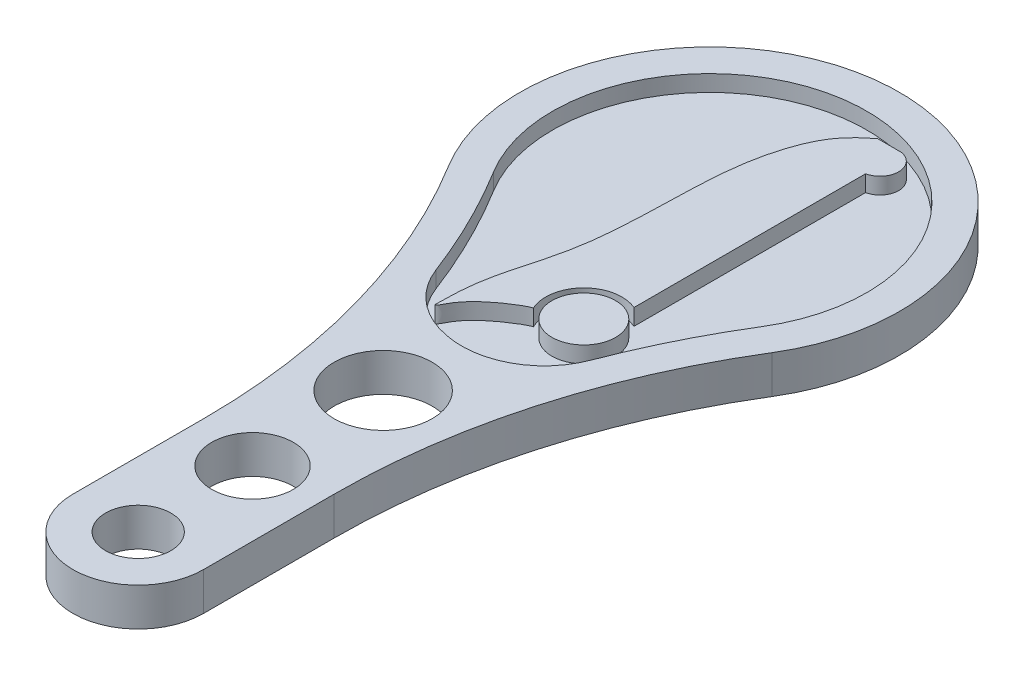
ISO-10303-21;
HEADER;
FILE_DESCRIPTION(('STEP AP214'),'2;1');
FILE_NAME('part.step','',(''),(''),'','','');
FILE_SCHEMA(('AUTOMOTIVE_DESIGN { 1 0 10303 214 1 1 1 1 }'));
ENDSEC;
DATA;
#1=APPLICATION_CONTEXT('core data for automotive mechanical design processes');
#2=APPLICATION_PROTOCOL_DEFINITION('international standard','automotive_design',2000,#1);
#3=PRODUCT_CONTEXT('',#1,'mechanical');
#4=PRODUCT('Part','Part','',(#3));
#5=PRODUCT_RELATED_PRODUCT_CATEGORY('part','',(#4));
#6=PRODUCT_DEFINITION_FORMATION('','',#4);
#7=PRODUCT_DEFINITION_CONTEXT('part definition',#1,'design');
#8=PRODUCT_DEFINITION('design','',#6,#7);
#9=PRODUCT_DEFINITION_SHAPE('','',#8);
#10=(LENGTH_UNIT() NAMED_UNIT(*) SI_UNIT(.MILLI.,.METRE.));
#11=(NAMED_UNIT(*) PLANE_ANGLE_UNIT() SI_UNIT($,.RADIAN.));
#12=(NAMED_UNIT(*) SI_UNIT($,.STERADIAN.) SOLID_ANGLE_UNIT());
#13=UNCERTAINTY_MEASURE_WITH_UNIT(LENGTH_MEASURE(1.E-05),#10,'distance_accuracy_value','');
#14=(GEOMETRIC_REPRESENTATION_CONTEXT(3) GLOBAL_UNCERTAINTY_ASSIGNED_CONTEXT((#13)) GLOBAL_UNIT_ASSIGNED_CONTEXT((#10,
#11,#12)) REPRESENTATION_CONTEXT('',''));
#15=CARTESIAN_POINT('',(0.,0.,0.));
#16=DIRECTION('',(0.,0.,1.));
#17=DIRECTION('',(1.,0.,0.));
#18=AXIS2_PLACEMENT_3D('',#15,#16,#17);
#19=CARTESIAN_POINT('',(2.35584712280132,1.33,10.0676855674392));
#20=DIRECTION('',(0.,1.,0.));
#21=DIRECTION('',(0.,0.,1.));
#22=AXIS2_PLACEMENT_3D('',#19,#20,#21);
#23=CYLINDRICAL_SURFACE('',#22,1.94920417460151);
#24=CARTESIAN_POINT('',(2.35584712280132,1.33,10.0676855674392));
#25=DIRECTION('',(0.,1.,0.));
#26=DIRECTION('',(0.,0.,1.));
#27=AXIS2_PLACEMENT_3D('',#24,#25,#26);
#28=CIRCLE('',#27,1.94920417460151);
#29=CARTESIAN_POINT('',(2.35584712280132,1.33,12.0168897420407));
#30=VERTEX_POINT('',#29);
#31=EDGE_CURVE('E11',#30,#30,#28,.T.);
#32=ORIENTED_EDGE('',*,*,#31,.T.);
#33=EDGE_LOOP('',(#32));
#34=FACE_BOUND('',#33,.T.);
#35=CARTESIAN_POINT('',(2.35584712280132,2.33,10.0676855674392));
#36=DIRECTION('',(0.,1.,0.));
#37=DIRECTION('',(0.,0.,1.));
#38=AXIS2_PLACEMENT_3D('',#35,#36,#37);
#39=CIRCLE('',#38,1.94920417460151);
#40=CARTESIAN_POINT('',(2.35584712280132,2.33,12.0168897420407));
#41=VERTEX_POINT('',#40);
#42=EDGE_CURVE('E49',#41,#41,#39,.T.);
#43=ORIENTED_EDGE('',*,*,#42,.F.);
#44=EDGE_LOOP('',(#43));
#45=FACE_BOUND('',#44,.T.);
#46=ADVANCED_FACE('F46',(#34,#45),#23,.T.);
#47=CARTESIAN_POINT('',(2.35584712280132,1.33,10.0676855674392));
#48=DIRECTION('',(0.,1.,0.));
#49=DIRECTION('',(0.,0.,1.));
#50=AXIS2_PLACEMENT_3D('',#47,#48,#49);
#51=PLANE('',#50);
#52=ORIENTED_EDGE('',*,*,#31,.F.);
#53=EDGE_LOOP('',(#52));
#54=FACE_BOUND('',#53,.T.);
#55=ADVANCED_FACE('F61',(#54),#51,.F.);
#56=CARTESIAN_POINT('',(2.35584712280132,2.33,10.0676855674392));
#57=DIRECTION('',(0.,1.,0.));
#58=DIRECTION('',(0.,0.,1.));
#59=AXIS2_PLACEMENT_3D('',#56,#57,#58);
#60=PLANE('',#59);
#61=ORIENTED_EDGE('',*,*,#42,.T.);
#62=EDGE_LOOP('',(#61));
#63=FACE_BOUND('',#62,.T.);
#64=ADVANCED_FACE('F58',(#63),#60,.T.);
#65=CLOSED_SHELL('',(#46,#55,#64));
#66=MANIFOLD_SOLID_BREP('B2',#65);
#67=CARTESIAN_POINT('',(1.78111711567941,1.33,-8.49492551439647));
#68=CARTESIAN_POINT('',(1.18318005927332,1.33,-8.00468919719487));
#69=CARTESIAN_POINT('',(0.982734781173089,1.33,-7.85157907838593));
#70=CARTESIAN_POINT('',(0.615420042679695,1.33,-7.44626626349667));
#71=CARTESIAN_POINT('',(0.330434469710681,1.33,-7.1106165886665));
#72=CARTESIAN_POINT('',(0.146777100463983,1.33,-6.85729607936071));
#73=CARTESIAN_POINT('',(-0.0835103105367978,1.33,-6.45480446057078));
#74=CARTESIAN_POINT('',(-0.339895147826504,1.33,-5.9612636487881));
#75=CARTESIAN_POINT('',(-0.668740254169848,1.33,-5.13014954373743));
#76=CARTESIAN_POINT('',(-0.942295018251991,1.33,-4.23132674746753));
#77=CARTESIAN_POINT('',(-1.14785582363387,1.33,-3.08008028249636));
#78=CARTESIAN_POINT('',(-1.28640882004444,1.33,-2.29248229105088));
#79=CARTESIAN_POINT('',(-1.28640882004444,1.33,-1.55115416078759));
#80=CARTESIAN_POINT('',(-1.37392048526993,1.33,-0.287096774197148));
#81=CARTESIAN_POINT('',(-1.45378432660316,1.33,1.92929888613166));
#82=CARTESIAN_POINT('',(-0.777696731086684,1.33,4.1071464967863));
#83=CARTESIAN_POINT('',(-1.58677607690457,1.33,5.4842603874083));
#84=CARTESIAN_POINT('',(-1.3142933284438,1.33,6.862486952761));
#85=CARTESIAN_POINT('',(-1.56478861208296,1.33,7.97301604356127));
#86=CARTESIAN_POINT('',(-3.15960858458561,1.33,9.67638397230756));
#87=CARTESIAN_POINT('',(-2.89320982157634,1.33,11.6792849185938));
#88=CARTESIAN_POINT('',(-2.9648414120418,1.33,13.8615451008543));
#89=B_SPLINE_CURVE_WITH_KNOTS('',21,(#67,#68,#69,#70,#71,#72,#73,#74,#75,#76,#77,#78,#79,#80,
#81,#82,#83,#84,#85,#86,#87,#88),.UNSPECIFIED.,.F.,.F.,(22,22),(0.,1.),.UNSPECIFIED.);
#90=DIRECTION('',(0.,1.,0.));
#91=VECTOR('',#90,1.);
#92=SURFACE_OF_LINEAR_EXTRUSION('',#89,#91);
#93=CARTESIAN_POINT('',(1.78111711567941,2.33,-8.49492551439647));
#94=CARTESIAN_POINT('',(1.18318005927332,2.33,-8.00468919719487));
#95=CARTESIAN_POINT('',(0.982734781173089,2.33,-7.85157907838593));
#96=CARTESIAN_POINT('',(0.615420042679695,2.33,-7.44626626349667));
#97=CARTESIAN_POINT('',(0.330434469710681,2.33,-7.1106165886665));
#98=CARTESIAN_POINT('',(0.146777100463983,2.33,-6.85729607936071));
#99=CARTESIAN_POINT('',(-0.0835103105367978,2.33,-6.45480446057078));
#100=CARTESIAN_POINT('',(-0.339895147826504,2.33,-5.9612636487881));
#101=CARTESIAN_POINT('',(-0.668740254169848,2.33,-5.13014954373743));
#102=CARTESIAN_POINT('',(-0.942295018251991,2.33,-4.23132674746753));
#103=CARTESIAN_POINT('',(-1.14785582363387,2.33,-3.08008028249636));
#104=CARTESIAN_POINT('',(-1.28640882004444,2.33,-2.29248229105088));
#105=CARTESIAN_POINT('',(-1.28640882004444,2.33,-1.55115416078759));
#106=CARTESIAN_POINT('',(-1.37392048526993,2.33,-0.287096774197148));
#107=CARTESIAN_POINT('',(-1.45378432660316,2.33,1.92929888613166));
#108=CARTESIAN_POINT('',(-0.777696731086684,2.33,4.1071464967863));
#109=CARTESIAN_POINT('',(-1.58677607690457,2.33,5.4842603874083));
#110=CARTESIAN_POINT('',(-1.3142933284438,2.33,6.862486952761));
#111=CARTESIAN_POINT('',(-1.56478861208296,2.33,7.97301604356127));
#112=CARTESIAN_POINT('',(-3.15960858458561,2.33,9.67638397230756));
#113=CARTESIAN_POINT('',(-2.89320982157634,2.33,11.6792849185938));
#114=CARTESIAN_POINT('',(-2.9648414120418,2.33,13.8615451008543));
#115=B_SPLINE_CURVE_WITH_KNOTS('',21,(#93,#94,#95,#96,#97,#98,#99,#100,#101,#102,#103,#104,#105,
#106,#107,#108,#109,#110,#111,#112,#113,#114),.UNSPECIFIED.,.F.,.F.,(22,22),(0.,1.),.UNSPECIFIED.);
#116=CARTESIAN_POINT('',(1.78111711567941,2.33,-8.49492551439647));
#117=VERTEX_POINT('',#116);
#118=CARTESIAN_POINT('',(-2.9648414120418,2.33,13.8615451008543));
#119=VERTEX_POINT('',#118);
#120=EDGE_CURVE('E188',#117,#119,#115,.T.);
#121=ORIENTED_EDGE('',*,*,#120,.F.);
#122=DIRECTION('',(0.,1.,0.));
#123=VECTOR('',#122,1.);
#124=CARTESIAN_POINT('',(1.78111711567941,1.33,-8.49492551439647));
#125=LINE('',#124,#123);
#126=CARTESIAN_POINT('',(1.78111711567941,1.33,-8.49492551439647));
#127=VERTEX_POINT('',#126);
#128=EDGE_CURVE('E44',#127,#117,#125,.T.);
#129=ORIENTED_EDGE('',*,*,#128,.F.);
#130=CARTESIAN_POINT('',(-2.9648414120418,1.33,13.8615451008543));
#131=VERTEX_POINT('',#130);
#132=EDGE_CURVE('E215',#127,#131,#89,.T.);
#133=ORIENTED_EDGE('',*,*,#132,.T.);
#134=DIRECTION('',(0.,1.,0.));
#135=VECTOR('',#134,1.);
#136=CARTESIAN_POINT('',(-2.9648414120418,1.33,13.8615451008543));
#137=LINE('',#136,#135);
#138=EDGE_CURVE('E100',#131,#119,#137,.T.);
#139=ORIENTED_EDGE('',*,*,#138,.T.);
#140=EDGE_LOOP('',(#121,#129,#133,#139));
#141=FACE_BOUND('',#140,.T.);
#142=ADVANCED_FACE('F96',(#141),#92,.T.);
#143=CARTESIAN_POINT('',(1.78111711567941,1.33,-8.49492551439647));
#144=DIRECTION('',(0.,0.,-1.));
#145=DIRECTION('',(-1.,0.,0.));
#146=AXIS2_PLACEMENT_3D('',#143,#144,#145);
#147=PLANE('',#146);
#148=DIRECTION('',(-1.,0.,0.));
#149=VECTOR('',#148,1.);
#150=CARTESIAN_POINT('',(1.78111711567941,2.33,-8.49492551439647));
#151=LINE('',#150,#149);
#152=CARTESIAN_POINT('',(3.28111711567941,2.33,-8.49492551439647));
#153=VERTEX_POINT('',#152);
#154=EDGE_CURVE('E213',#153,#117,#151,.T.);
#155=ORIENTED_EDGE('',*,*,#154,.F.);
#156=DIRECTION('',(0.,1.,0.));
#157=VECTOR('',#156,1.);
#158=CARTESIAN_POINT('',(3.28111711567941,1.33,-8.49492551439647));
#159=LINE('',#158,#157);
#160=CARTESIAN_POINT('',(3.28111711567941,1.33,-8.49492551439647));
#161=VERTEX_POINT('',#160);
#162=EDGE_CURVE('E106',#161,#153,#159,.T.);
#163=ORIENTED_EDGE('',*,*,#162,.F.);
#164=DIRECTION('',(-1.,0.,0.));
#165=VECTOR('',#164,1.);
#166=CARTESIAN_POINT('',(1.78111711567941,1.33,-8.49492551439647));
#167=LINE('',#166,#165);
#168=EDGE_CURVE('E178',#161,#127,#167,.T.);
#169=ORIENTED_EDGE('',*,*,#168,.T.);
#170=ORIENTED_EDGE('',*,*,#128,.T.);
#171=EDGE_LOOP('',(#155,#163,#169,#170));
#172=FACE_BOUND('',#171,.T.);
#173=ADVANCED_FACE('F225',(#172),#147,.T.);
#174=CARTESIAN_POINT('',(3.28111711567941,1.33,-8.49492551439647));
#175=DIRECTION('',(1.,0.,0.));
#176=DIRECTION('',(0.,0.,-1.));
#177=AXIS2_PLACEMENT_3D('',#174,#175,#176);
#178=PLANE('',#177);
#179=DIRECTION('',(0.,0.,-1.));
#180=VECTOR('',#179,1.);
#181=CARTESIAN_POINT('',(3.28111711567941,2.33,-8.49492551439647));
#182=LINE('',#181,#180);
#183=CARTESIAN_POINT('',(3.28111711567941,2.33,-8.49086116477634));
#184=VERTEX_POINT('',#183);
#185=EDGE_CURVE('E165',#184,#153,#182,.T.);
#186=ORIENTED_EDGE('',*,*,#185,.F.);
#187=DIRECTION('',(0.,1.,0.));
#188=VECTOR('',#187,1.);
#189=CARTESIAN_POINT('',(3.28111711567941,1.33,-8.49086116477634));
#190=LINE('',#189,#188);
#191=CARTESIAN_POINT('',(3.28111711567941,1.33,-8.49086116477634));
#192=VERTEX_POINT('',#191);
#193=EDGE_CURVE('E160',#192,#184,#190,.T.);
#194=ORIENTED_EDGE('',*,*,#193,.F.);
#195=DIRECTION('',(0.,0.,-1.));
#196=VECTOR('',#195,1.);
#197=CARTESIAN_POINT('',(3.28111711567941,1.33,-8.49492551439647));
#198=LINE('',#197,#196);
#199=EDGE_CURVE('E163',#192,#161,#198,.T.);
#200=ORIENTED_EDGE('',*,*,#199,.T.);
#201=ORIENTED_EDGE('',*,*,#162,.T.);
#202=EDGE_LOOP('',(#186,#194,#200,#201));
#203=FACE_BOUND('',#202,.T.);
#204=ADVANCED_FACE('F162',(#203),#178,.T.);
#205=CARTESIAN_POINT('',(3.05515238745392,1.33,-7.37826065267223));
#206=DIRECTION('',(0.,1.,0.));
#207=DIRECTION('',(0.,0.,1.));
#208=AXIS2_PLACEMENT_3D('',#205,#206,#207);
#209=CYLINDRICAL_SURFACE('',#208,1.13531491575524);
#210=CARTESIAN_POINT('',(3.05515238745392,2.33,-7.37826065267223));
#211=DIRECTION('',(0.,1.,0.));
#212=DIRECTION('',(0.,0.,1.));
#213=AXIS2_PLACEMENT_3D('',#210,#211,#212);
#214=CIRCLE('',#213,1.13531491575524);
#215=CARTESIAN_POINT('',(3.28111711567941,2.33,-6.26566014056813));
#216=VERTEX_POINT('',#215);
#217=EDGE_CURVE('E210',#216,#184,#214,.T.);
#218=ORIENTED_EDGE('',*,*,#217,.F.);
#219=DIRECTION('',(0.,1.,0.));
#220=VECTOR('',#219,1.);
#221=CARTESIAN_POINT('',(3.28111711567941,1.33,-6.26566014056813));
#222=LINE('',#221,#220);
#223=CARTESIAN_POINT('',(3.28111711567941,1.33,-6.26566014056813));
#224=VERTEX_POINT('',#223);
#225=EDGE_CURVE('E170',#224,#216,#222,.T.);
#226=ORIENTED_EDGE('',*,*,#225,.F.);
#227=CARTESIAN_POINT('',(3.05515238745392,1.33,-7.37826065267223));
#228=DIRECTION('',(0.,1.,0.));
#229=DIRECTION('',(0.,0.,1.));
#230=AXIS2_PLACEMENT_3D('',#227,#228,#229);
#231=CIRCLE('',#230,1.13531491575524);
#232=EDGE_CURVE('E176',#224,#192,#231,.T.);
#233=ORIENTED_EDGE('',*,*,#232,.T.);
#234=ORIENTED_EDGE('',*,*,#193,.T.);
#235=EDGE_LOOP('',(#218,#226,#233,#234));
#236=FACE_BOUND('',#235,.T.);
#237=ADVANCED_FACE('F180',(#236),#209,.T.);
#238=CARTESIAN_POINT('',(3.28111711567941,1.33,-6.26566014056813));
#239=DIRECTION('',(1.,0.,0.));
#240=DIRECTION('',(0.,0.,-1.));
#241=AXIS2_PLACEMENT_3D('',#238,#239,#240);
#242=PLANE('',#241);
#243=DIRECTION('',(0.,0.,-1.));
#244=VECTOR('',#243,1.);
#245=CARTESIAN_POINT('',(3.28111711567941,2.33,-6.26566014056813));
#246=LINE('',#245,#244);
#247=CARTESIAN_POINT('',(3.28111711567941,2.33,7.92174945219014));
#248=VERTEX_POINT('',#247);
#249=EDGE_CURVE('E207',#248,#216,#246,.T.);
#250=ORIENTED_EDGE('',*,*,#249,.F.);
#251=DIRECTION('',(0.,1.,0.));
#252=VECTOR('',#251,1.);
#253=CARTESIAN_POINT('',(3.28111711567941,1.33,7.92174945219014));
#254=LINE('',#253,#252);
#255=CARTESIAN_POINT('',(3.28111711567941,1.33,7.92174945219014));
#256=VERTEX_POINT('',#255);
#257=EDGE_CURVE('E219',#256,#248,#254,.T.);
#258=ORIENTED_EDGE('',*,*,#257,.F.);
#259=DIRECTION('',(0.,0.,-1.));
#260=VECTOR('',#259,1.);
#261=CARTESIAN_POINT('',(3.28111711567941,1.33,-6.26566014056813));
#262=LINE('',#261,#260);
#263=EDGE_CURVE('E181',#256,#224,#262,.T.);
#264=ORIENTED_EDGE('',*,*,#263,.T.);
#265=ORIENTED_EDGE('',*,*,#225,.T.);
#266=EDGE_LOOP('',(#250,#258,#264,#265));
#267=FACE_BOUND('',#266,.T.);
#268=ADVANCED_FACE('F238',(#267),#242,.T.);
#269=CARTESIAN_POINT('',(2.35584712280132,1.33,10.0676855674392));
#270=DIRECTION('',(0.,1.,0.));
#271=DIRECTION('',(0.,0.,1.));
#272=AXIS2_PLACEMENT_3D('',#269,#270,#271);
#273=CYLINDRICAL_SURFACE('',#272,2.33691385601845);
#274=CARTESIAN_POINT('',(2.35584712280132,2.33,10.0676855674392));
#275=DIRECTION('',(0.,-1.,0.));
#276=DIRECTION('',(0.,0.,1.));
#277=AXIS2_PLACEMENT_3D('',#274,#275,#276);
#278=CIRCLE('',#277,2.33691385601845);
#279=CARTESIAN_POINT('',(0.226117198706706,2.33,11.029671440967));
#280=VERTEX_POINT('',#279);
#281=EDGE_CURVE('E201',#280,#248,#278,.T.);
#282=ORIENTED_EDGE('',*,*,#281,.F.);
#283=DIRECTION('',(0.,1.,0.));
#284=VECTOR('',#283,1.);
#285=CARTESIAN_POINT('',(0.226117198706706,1.33,11.029671440967));
#286=LINE('',#285,#284);
#287=CARTESIAN_POINT('',(0.226117198706706,1.33,11.029671440967));
#288=VERTEX_POINT('',#287);
#289=EDGE_CURVE('E220',#288,#280,#286,.T.);
#290=ORIENTED_EDGE('',*,*,#289,.F.);
#291=CARTESIAN_POINT('',(2.35584712280132,1.33,10.0676855674392));
#292=DIRECTION('',(0.,-1.,0.));
#293=DIRECTION('',(0.,0.,1.));
#294=AXIS2_PLACEMENT_3D('',#291,#292,#293);
#295=CIRCLE('',#294,2.33691385601845);
#296=EDGE_CURVE('E183',#288,#256,#295,.T.);
#297=ORIENTED_EDGE('',*,*,#296,.T.);
#298=ORIENTED_EDGE('',*,*,#257,.T.);
#299=EDGE_LOOP('',(#282,#290,#297,#298));
#300=FACE_BOUND('',#299,.T.);
#301=ADVANCED_FACE('F241',(#300),#273,.F.);
#302=CARTESIAN_POINT('',(-2.9648414120418,1.33,13.8615451008543));
#303=CARTESIAN_POINT('',(-2.68941343013303,1.33,13.8577408821963));
#304=CARTESIAN_POINT('',(-2.76468354600282,1.33,13.1389949437615));
#305=CARTESIAN_POINT('',(-2.08602989904163,1.33,12.4170286257182));
#306=CARTESIAN_POINT('',(-1.11541292891549,1.33,11.7514256517854));
#307=CARTESIAN_POINT('',(-0.160442749527065,1.33,11.1270053622062));
#308=CARTESIAN_POINT('',(0.226117198706707,1.33,11.029671440967));
#309=B_SPLINE_CURVE_WITH_KNOTS('',6,(#302,#303,#304,#305,#306,#307,#308),.UNSPECIFIED.,.F.,.F.,
(7,7),(0.,1.),.UNSPECIFIED.);
#310=DIRECTION('',(0.,1.,0.));
#311=VECTOR('',#310,1.);
#312=SURFACE_OF_LINEAR_EXTRUSION('',#309,#311);
#313=CARTESIAN_POINT('',(-2.9648414120418,2.33,13.8615451008543));
#314=CARTESIAN_POINT('',(-2.68941343013303,2.33,13.8577408821963));
#315=CARTESIAN_POINT('',(-2.76468354600282,2.33,13.1389949437615));
#316=CARTESIAN_POINT('',(-2.08602989904163,2.33,12.4170286257182));
#317=CARTESIAN_POINT('',(-1.11541292891549,2.33,11.7514256517854));
#318=CARTESIAN_POINT('',(-0.160442749527065,2.33,11.1270053622062));
#319=CARTESIAN_POINT('',(0.226117198706707,2.33,11.029671440967));
#320=B_SPLINE_CURVE_WITH_KNOTS('',6,(#313,#314,#315,#316,#317,#318,#319),.UNSPECIFIED.,.F.,.F.,
(7,7),(0.,1.),.UNSPECIFIED.);
#321=EDGE_CURVE('E193',#119,#280,#320,.T.);
#322=ORIENTED_EDGE('',*,*,#321,.F.);
#323=ORIENTED_EDGE('',*,*,#138,.F.);
#324=EDGE_CURVE('E247',#131,#288,#309,.T.);
#325=ORIENTED_EDGE('',*,*,#324,.T.);
#326=ORIENTED_EDGE('',*,*,#289,.T.);
#327=EDGE_LOOP('',(#322,#323,#325,#326));
#328=FACE_BOUND('',#327,.T.);
#329=ADVANCED_FACE('F222',(#328),#312,.T.);
#330=CARTESIAN_POINT('',(-1.05934022035526,1.33,-2.53747828552304));
#331=DIRECTION('',(0.,-1.,0.));
#332=DIRECTION('',(0.,0.,-1.));
#333=AXIS2_PLACEMENT_3D('',#330,#331,#332);
#334=PLANE('',#333);
#335=ORIENTED_EDGE('',*,*,#132,.F.);
#336=ORIENTED_EDGE('',*,*,#168,.F.);
#337=ORIENTED_EDGE('',*,*,#199,.F.);
#338=ORIENTED_EDGE('',*,*,#232,.F.);
#339=ORIENTED_EDGE('',*,*,#263,.F.);
#340=ORIENTED_EDGE('',*,*,#296,.F.);
#341=ORIENTED_EDGE('',*,*,#324,.F.);
#342=EDGE_LOOP('',(#335,#336,#337,#338,#339,#340,#341));
#343=FACE_BOUND('',#342,.T.);
#344=ADVANCED_FACE('F174',(#343),#334,.T.);
#345=CARTESIAN_POINT('',(-1.05934022035526,2.33,-2.53747828552304));
#346=DIRECTION('',(0.,-1.,0.));
#347=DIRECTION('',(0.,0.,-1.));
#348=AXIS2_PLACEMENT_3D('',#345,#346,#347);
#349=PLANE('',#348);
#350=ORIENTED_EDGE('',*,*,#120,.T.);
#351=ORIENTED_EDGE('',*,*,#321,.T.);
#352=ORIENTED_EDGE('',*,*,#281,.T.);
#353=ORIENTED_EDGE('',*,*,#249,.T.);
#354=ORIENTED_EDGE('',*,*,#217,.T.);
#355=ORIENTED_EDGE('',*,*,#185,.T.);
#356=ORIENTED_EDGE('',*,*,#154,.T.);
#357=EDGE_LOOP('',(#350,#351,#352,#353,#354,#355,#356));
#358=FACE_BOUND('',#357,.T.);
#359=ADVANCED_FACE('F224',(#358),#349,.F.);
#360=CLOSED_SHELL('',(#142,#173,#204,#237,#268,#301,#329,#344,#359));
#361=MANIFOLD_SOLID_BREP('B6',#360);
#362=CARTESIAN_POINT('',(0.,2.33,0.));
#363=DIRECTION('',(0.,1.,0.));
#364=DIRECTION('',(0.,0.,1.));
#365=AXIS2_PLACEMENT_3D('',#362,#363,#364);
#366=PLANE('',#365);
#367=CARTESIAN_POINT('',(0.,2.33,35.));
#368=DIRECTION('',(0.,1.,0.));
#369=DIRECTION('',(0.,0.,1.));
#370=AXIS2_PLACEMENT_3D('',#367,#368,#369);
#371=CIRCLE('',#370,2.);
#372=CARTESIAN_POINT('',(0.,2.33,37.));
#373=VERTEX_POINT('',#372);
#374=EDGE_CURVE('E551',#373,#373,#371,.T.);
#375=ORIENTED_EDGE('',*,*,#374,.F.);
#376=EDGE_LOOP('',(#375));
#377=FACE_BOUND('',#376,.T.);
#378=DIRECTION('',(-3.08600307322036E-05,0.,-0.999999999523829));
#379=VECTOR('',#378,1.);
#380=CARTESIAN_POINT('',(3.99925674937041,2.33,10.9154280929616));
#381=LINE('',#380,#379);
#382=CARTESIAN_POINT('',(3.99999999999999,2.33,35.));
#383=VERTEX_POINT('',#382);
#384=CARTESIAN_POINT('',(3.99975325061723,2.33,27.0042405405633));
#385=VERTEX_POINT('',#384);
#386=EDGE_CURVE('E565',#383,#385,#381,.T.);
#387=ORIENTED_EDGE('',*,*,#386,.T.);
#388=CARTESIAN_POINT('',(43.9997532315704,2.33,27.003006139334));
#389=DIRECTION('',(0.,1.,0.));
#390=DIRECTION('',(0.,0.,1.));
#391=AXIS2_PLACEMENT_3D('',#388,#389,#390);
#392=CIRCLE('',#391,40.);
#393=CARTESIAN_POINT('',(9.90793474706065,2.33,6.08058007495899));
#394=VERTEX_POINT('',#393);
#395=EDGE_CURVE('E594',#385,#394,#392,.F.);
#396=ORIENTED_EDGE('',*,*,#395,.T.);
#397=CARTESIAN_POINT('',(0.,2.33,0.));
#398=DIRECTION('',(0.,1.,0.));
#399=DIRECTION('',(0.,0.,1.));
#400=AXIS2_PLACEMENT_3D('',#397,#398,#399);
#401=CIRCLE('',#400,11.625);
#402=CARTESIAN_POINT('',(-9.9075208807045,2.33,6.08125439349516));
#403=VERTEX_POINT('',#402);
#404=EDGE_CURVE('E557',#394,#403,#401,.T.);
#405=ORIENTED_EDGE('',*,*,#404,.T.);
#406=CARTESIAN_POINT('',(-43.9979153089351,2.33,27.0060006936936));
#407=DIRECTION('',(0.,1.,0.));
#408=DIRECTION('',(0.,0.,1.));
#409=AXIS2_PLACEMENT_3D('',#406,#407,#408);
#410=CIRCLE('',#409,40.);
#411=CARTESIAN_POINT('',(-3.99791667085768,2.33,27.0164387877521));
#412=VERTEX_POINT('',#411);
#413=EDGE_CURVE('E598',#403,#412,#410,.F.);
#414=ORIENTED_EDGE('',*,*,#413,.T.);
#415=DIRECTION('',(-0.000260952351462385,0.,0.999999965951935));
#416=VECTOR('',#415,1.);
#417=CARTESIAN_POINT('',(-3.99371560348128,2.33,10.917456694602));
#418=LINE('',#417,#416);
#419=CARTESIAN_POINT('',(-3.99999999999998,2.33,35.));
#420=VERTEX_POINT('',#419);
#421=EDGE_CURVE('E560',#412,#420,#418,.T.);
#422=ORIENTED_EDGE('',*,*,#421,.T.);
#423=CARTESIAN_POINT('',(0.,2.33,35.));
#424=DIRECTION('',(0.,1.,0.));
#425=DIRECTION('',(0.,0.,1.));
#426=AXIS2_PLACEMENT_3D('',#423,#424,#425);
#427=CIRCLE('',#426,3.99999999999999);
#428=EDGE_CURVE('E563',#420,#383,#427,.T.);
#429=ORIENTED_EDGE('',*,*,#428,.T.);
#430=EDGE_LOOP('',(#387,#396,#405,#414,#422,#429));
#431=FACE_BOUND('',#430,.T.);
#432=CARTESIAN_POINT('',(0.,2.33,20.));
#433=DIRECTION('',(0.,1.,0.));
#434=DIRECTION('',(0.,0.,1.));
#435=AXIS2_PLACEMENT_3D('',#432,#433,#434);
#436=CIRCLE('',#435,3.);
#437=CARTESIAN_POINT('',(0.,2.33,23.));
#438=VERTEX_POINT('',#437);
#439=EDGE_CURVE('E537',#438,#438,#436,.T.);
#440=ORIENTED_EDGE('',*,*,#439,.F.);
#441=EDGE_LOOP('',(#440));
#442=FACE_BOUND('',#441,.T.);
#443=CARTESIAN_POINT('',(0.,2.33,28.));
#444=DIRECTION('',(0.,1.,0.));
#445=DIRECTION('',(0.,0.,1.));
#446=AXIS2_PLACEMENT_3D('',#443,#444,#445);
#447=CIRCLE('',#446,2.5);
#448=CARTESIAN_POINT('',(0.,2.33,30.5));
#449=VERTEX_POINT('',#448);
#450=EDGE_CURVE('E543',#449,#449,#447,.T.);
#451=ORIENTED_EDGE('',*,*,#450,.F.);
#452=EDGE_LOOP('',(#451));
#453=FACE_BOUND('',#452,.T.);
#454=CARTESIAN_POINT('',(0.,2.33,0.));
#455=DIRECTION('',(0.,1.,0.));
#456=DIRECTION('',(0.,0.,1.));
#457=AXIS2_PLACEMENT_3D('',#454,#455,#456);
#458=CIRCLE('',#457,9.625);
#459=CARTESIAN_POINT('',(8.20334382283516,2.33,5.03445877174024));
#460=VERTEX_POINT('',#459);
#461=CARTESIAN_POINT('',(-8.20300115929298,2.33,5.03501707848523));
#462=VERTEX_POINT('',#461);
#463=EDGE_CURVE('E421',#460,#462,#458,.T.);
#464=ORIENTED_EDGE('',*,*,#463,.F.);
#465=CARTESIAN_POINT('',(43.9997532315704,2.33,27.003006139334));
#466=DIRECTION('',(0.,-1.,0.));
#467=DIRECTION('',(0.,0.,1.));
#468=AXIS2_PLACEMENT_3D('',#465,#466,#467);
#469=CIRCLE('',#468,42.);
#470=CARTESIAN_POINT('',(4.7650591607945,2.33,12.0150516033534));
#471=VERTEX_POINT('',#470);
#472=EDGE_CURVE('E435',#471,#460,#469,.T.);
#473=ORIENTED_EDGE('',*,*,#472,.F.);
#474=CARTESIAN_POINT('',(0.0942622476069006,2.33,10.2307713014509));
#475=DIRECTION('',(0.,1.,0.));
#476=DIRECTION('',(0.,0.,1.));
#477=AXIS2_PLACEMENT_3D('',#474,#475,#476);
#478=CIRCLE('',#477,5.);
#479=CARTESIAN_POINT('',(1.32332507481193,2.33,15.0773582001645));
#480=VERTEX_POINT('',#479);
#481=EDGE_CURVE('E334',#471,#480,#478,.F.);
#482=ORIENTED_EDGE('',*,*,#481,.T.);
#483=CARTESIAN_POINT('',(-4.1870681382967,2.33,13.6233086044286));
#484=CARTESIAN_POINT('',(-1.14189197239547,2.33,15.7746695411282));
#485=CARTESIAN_POINT('',(1.16463664982423,2.33,15.7746695411282));
#486=CARTESIAN_POINT('',(4.1717037712279,2.33,13.6715967545573));
#487=B_SPLINE_CURVE_WITH_KNOTS('',3,(#483,#484,#485,#486),.UNSPECIFIED.,.F.,.F.,(4,4),(0.,1.),.UNSPECIFIED.);
#488=CARTESIAN_POINT('',(-1.62101793471806,2.33,14.9755089824347));
#489=VERTEX_POINT('',#488);
#490=EDGE_CURVE('E437',#489,#480,#487,.T.);
#491=ORIENTED_EDGE('',*,*,#490,.F.);
#492=CARTESIAN_POINT('',(-0.100642451666446,2.33,10.2122686577675));
#493=DIRECTION('',(0.,1.,0.));
#494=DIRECTION('',(0.,0.,1.));
#495=AXIS2_PLACEMENT_3D('',#492,#493,#494);
#496=CIRCLE('',#495,5.);
#497=CARTESIAN_POINT('',(-4.77056509605656,2.33,11.9988358956319));
#498=VERTEX_POINT('',#497);
#499=EDGE_CURVE('E94',#489,#498,#496,.F.);
#500=ORIENTED_EDGE('',*,*,#499,.T.);
#501=CARTESIAN_POINT('',(-43.9979153089351,2.33,27.0060006936936));
#502=DIRECTION('',(0.,-1.,0.));
#503=DIRECTION('',(0.,0.,1.));
#504=AXIS2_PLACEMENT_3D('',#501,#502,#503);
#505=CIRCLE('',#504,42.);
#506=EDGE_CURVE('E528',#462,#498,#505,.T.);
#507=ORIENTED_EDGE('',*,*,#506,.F.);
#508=EDGE_LOOP('',(#464,#473,#482,#491,#500,#507));
#509=FACE_BOUND('',#508,.T.);
#510=ADVANCED_FACE('F326',(#377,#431,#442,#453,#509),#366,.T.);
#511=CARTESIAN_POINT('',(0.,0.,0.));
#512=DIRECTION('',(0.,1.,0.));
#513=DIRECTION('',(0.,0.,1.));
#514=AXIS2_PLACEMENT_3D('',#511,#512,#513);
#515=PLANE('',#514);
#516=CARTESIAN_POINT('',(0.,0.,28.));
#517=DIRECTION('',(0.,1.,0.));
#518=DIRECTION('',(0.,0.,1.));
#519=AXIS2_PLACEMENT_3D('',#516,#517,#518);
#520=CIRCLE('',#519,2.5);
#521=CARTESIAN_POINT('',(0.,0.,30.5));
#522=VERTEX_POINT('',#521);
#523=EDGE_CURVE('E539',#522,#522,#520,.T.);
#524=ORIENTED_EDGE('',*,*,#523,.T.);
#525=EDGE_LOOP('',(#524));
#526=FACE_BOUND('',#525,.T.);
#527=CARTESIAN_POINT('',(0.,0.,20.));
#528=DIRECTION('',(0.,1.,0.));
#529=DIRECTION('',(0.,0.,1.));
#530=AXIS2_PLACEMENT_3D('',#527,#528,#529);
#531=CIRCLE('',#530,3.);
#532=CARTESIAN_POINT('',(0.,0.,23.));
#533=VERTEX_POINT('',#532);
#534=EDGE_CURVE('E546',#533,#533,#531,.T.);
#535=ORIENTED_EDGE('',*,*,#534,.T.);
#536=EDGE_LOOP('',(#535));
#537=FACE_BOUND('',#536,.T.);
#538=CARTESIAN_POINT('',(0.,0.,0.));
#539=DIRECTION('',(0.,1.,0.));
#540=DIRECTION('',(0.,0.,1.));
#541=AXIS2_PLACEMENT_3D('',#538,#539,#540);
#542=CIRCLE('',#541,11.625);
#543=CARTESIAN_POINT('',(9.90793474706065,0.,6.08058007495899));
#544=VERTEX_POINT('',#543);
#545=CARTESIAN_POINT('',(-9.9075208807045,0.,6.08125439349516));
#546=VERTEX_POINT('',#545);
#547=EDGE_CURVE('E554',#544,#546,#542,.T.);
#548=ORIENTED_EDGE('',*,*,#547,.F.);
#549=CARTESIAN_POINT('',(43.9997532315704,0.,27.003006139334));
#550=DIRECTION('',(0.,1.,0.));
#551=DIRECTION('',(0.,0.,1.));
#552=AXIS2_PLACEMENT_3D('',#549,#550,#551);
#553=CIRCLE('',#552,40.);
#554=CARTESIAN_POINT('',(3.99975325061723,0.,27.0042405405633));
#555=VERTEX_POINT('',#554);
#556=EDGE_CURVE('E592',#544,#555,#553,.T.);
#557=ORIENTED_EDGE('',*,*,#556,.T.);
#558=DIRECTION('',(-3.08600307322036E-05,0.,-0.999999999523829));
#559=VECTOR('',#558,1.);
#560=CARTESIAN_POINT('',(3.99925674937041,0.,10.9154280929616));
#561=LINE('',#560,#559);
#562=CARTESIAN_POINT('',(3.99999999999999,0.,35.));
#563=VERTEX_POINT('',#562);
#564=EDGE_CURVE('E561',#563,#555,#561,.T.);
#565=ORIENTED_EDGE('',*,*,#564,.F.);
#566=CARTESIAN_POINT('',(0.,0.,35.));
#567=DIRECTION('',(0.,1.,0.));
#568=DIRECTION('',(0.,0.,1.));
#569=AXIS2_PLACEMENT_3D('',#566,#567,#568);
#570=CIRCLE('',#569,3.99999999999999);
#571=CARTESIAN_POINT('',(-3.99999999999998,0.,35.));
#572=VERTEX_POINT('',#571);
#573=EDGE_CURVE('E573',#572,#563,#570,.T.);
#574=ORIENTED_EDGE('',*,*,#573,.F.);
#575=DIRECTION('',(-0.000260952351462385,0.,0.999999965951935));
#576=VECTOR('',#575,1.);
#577=CARTESIAN_POINT('',(-3.99371560348128,0.,10.917456694602));
#578=LINE('',#577,#576);
#579=CARTESIAN_POINT('',(-3.99791667085768,0.,27.0164387877521));
#580=VERTEX_POINT('',#579);
#581=EDGE_CURVE('E571',#580,#572,#578,.T.);
#582=ORIENTED_EDGE('',*,*,#581,.F.);
#583=CARTESIAN_POINT('',(-43.9979153089351,0.,27.0060006936936));
#584=DIRECTION('',(0.,1.,0.));
#585=DIRECTION('',(0.,0.,1.));
#586=AXIS2_PLACEMENT_3D('',#583,#584,#585);
#587=CIRCLE('',#586,40.);
#588=EDGE_CURVE('E596',#580,#546,#587,.T.);
#589=ORIENTED_EDGE('',*,*,#588,.T.);
#590=EDGE_LOOP('',(#548,#557,#565,#574,#582,#589));
#591=FACE_BOUND('',#590,.T.);
#592=CARTESIAN_POINT('',(0.,0.,35.));
#593=DIRECTION('',(0.,1.,0.));
#594=DIRECTION('',(0.,0.,1.));
#595=AXIS2_PLACEMENT_3D('',#592,#593,#594);
#596=CIRCLE('',#595,2.);
#597=CARTESIAN_POINT('',(0.,0.,37.));
#598=VERTEX_POINT('',#597);
#599=EDGE_CURVE('E542',#598,#598,#596,.T.);
#600=ORIENTED_EDGE('',*,*,#599,.T.);
#601=EDGE_LOOP('',(#600));
#602=FACE_BOUND('',#601,.T.);
#603=ADVANCED_FACE('F477',(#526,#537,#591,#602),#515,.F.);
#604=CARTESIAN_POINT('',(0.,2.33,0.));
#605=DIRECTION('',(0.,-1.,0.));
#606=DIRECTION('',(0.,0.,-1.));
#607=AXIS2_PLACEMENT_3D('',#604,#605,#606);
#608=CYLINDRICAL_SURFACE('',#607,11.625);
#609=ORIENTED_EDGE('',*,*,#404,.F.);
#610=DIRECTION('',(0.,-1.,0.));
#611=VECTOR('',#610,1.);
#612=CARTESIAN_POINT('',(9.90793474706065,2.33,6.08058007495899));
#613=LINE('',#612,#611);
#614=EDGE_CURVE('E584',#394,#544,#613,.T.);
#615=ORIENTED_EDGE('',*,*,#614,.T.);
#616=ORIENTED_EDGE('',*,*,#547,.T.);
#617=DIRECTION('',(0.,-1.,0.));
#618=VECTOR('',#617,1.);
#619=CARTESIAN_POINT('',(-9.9075208807045,2.33,6.08125439349516));
#620=LINE('',#619,#618);
#621=EDGE_CURVE('E582',#546,#403,#620,.F.);
#622=ORIENTED_EDGE('',*,*,#621,.T.);
#623=EDGE_LOOP('',(#609,#615,#616,#622));
#624=FACE_BOUND('',#623,.T.);
#625=ADVANCED_FACE('F481',(#624),#608,.T.);
#626=CARTESIAN_POINT('',(-3.99371560348128,2.33,10.917456694602));
#627=DIRECTION('',(0.999999965951935,0.,0.000260952351462385));
#628=DIRECTION('',(0.000260952351462385,0.,-0.999999965951935));
#629=AXIS2_PLACEMENT_3D('',#626,#627,#628);
#630=PLANE('',#629);
#631=ORIENTED_EDGE('',*,*,#421,.F.);
#632=DIRECTION('',(0.,1.,0.));
#633=VECTOR('',#632,1.);
#634=CARTESIAN_POINT('',(-3.99791667085768,0.,27.0164387877521));
#635=LINE('',#634,#633);
#636=EDGE_CURVE('E589',#412,#580,#635,.F.);
#637=ORIENTED_EDGE('',*,*,#636,.T.);
#638=ORIENTED_EDGE('',*,*,#581,.T.);
#639=DIRECTION('',(0.,-1.,0.));
#640=VECTOR('',#639,1.);
#641=CARTESIAN_POINT('',(-3.99999999999998,2.33,35.));
#642=LINE('',#641,#640);
#643=EDGE_CURVE('E579',#420,#572,#642,.T.);
#644=ORIENTED_EDGE('',*,*,#643,.F.);
#645=EDGE_LOOP('',(#631,#637,#638,#644));
#646=FACE_BOUND('',#645,.T.);
#647=ADVANCED_FACE('F489',(#646),#630,.F.);
#648=CARTESIAN_POINT('',(0.,2.33,35.));
#649=DIRECTION('',(0.,-1.,0.));
#650=DIRECTION('',(0.,0.,-1.));
#651=AXIS2_PLACEMENT_3D('',#648,#649,#650);
#652=CYLINDRICAL_SURFACE('',#651,3.99999999999999);
#653=ORIENTED_EDGE('',*,*,#573,.T.);
#654=DIRECTION('',(0.,-1.,0.));
#655=VECTOR('',#654,1.);
#656=CARTESIAN_POINT('',(3.99999999999999,2.33,35.));
#657=LINE('',#656,#655);
#658=EDGE_CURVE('E568',#383,#563,#657,.T.);
#659=ORIENTED_EDGE('',*,*,#658,.F.);
#660=ORIENTED_EDGE('',*,*,#428,.F.);
#661=ORIENTED_EDGE('',*,*,#643,.T.);
#662=EDGE_LOOP('',(#653,#659,#660,#661));
#663=FACE_BOUND('',#662,.T.);
#664=ADVANCED_FACE('F485',(#663),#652,.T.);
#665=CARTESIAN_POINT('',(3.99925674937041,2.33,10.9154280929616));
#666=DIRECTION('',(-0.999999999523829,0.,3.08600307322036E-05));
#667=DIRECTION('',(3.08600307322036E-05,0.,0.999999999523829));
#668=AXIS2_PLACEMENT_3D('',#665,#666,#667);
#669=PLANE('',#668);
#670=ORIENTED_EDGE('',*,*,#564,.T.);
#671=DIRECTION('',(0.,1.,0.));
#672=VECTOR('',#671,1.);
#673=CARTESIAN_POINT('',(3.99975325061723,2.33,27.0042405405633));
#674=LINE('',#673,#672);
#675=EDGE_CURVE('E587',#555,#385,#674,.T.);
#676=ORIENTED_EDGE('',*,*,#675,.T.);
#677=ORIENTED_EDGE('',*,*,#386,.F.);
#678=ORIENTED_EDGE('',*,*,#658,.T.);
#679=EDGE_LOOP('',(#670,#676,#677,#678));
#680=FACE_BOUND('',#679,.T.);
#681=ADVANCED_FACE('F473',(#680),#669,.F.);
#682=CARTESIAN_POINT('',(0.,2.33,35.));
#683=DIRECTION('',(0.,-1.,0.));
#684=DIRECTION('',(0.,0.,-1.));
#685=AXIS2_PLACEMENT_3D('',#682,#683,#684);
#686=CYLINDRICAL_SURFACE('',#685,2.);
#687=ORIENTED_EDGE('',*,*,#374,.T.);
#688=EDGE_LOOP('',(#687));
#689=FACE_BOUND('',#688,.T.);
#690=ORIENTED_EDGE('',*,*,#599,.F.);
#691=EDGE_LOOP('',(#690));
#692=FACE_BOUND('',#691,.T.);
#693=ADVANCED_FACE('F469',(#689,#692),#686,.F.);
#694=CARTESIAN_POINT('',(43.9997532315704,2.33,27.003006139334));
#695=DIRECTION('',(0.,-1.,0.));
#696=DIRECTION('',(0.,0.,-1.));
#697=AXIS2_PLACEMENT_3D('',#694,#695,#696);
#698=CYLINDRICAL_SURFACE('',#697,40.);
#699=ORIENTED_EDGE('',*,*,#395,.F.);
#700=ORIENTED_EDGE('',*,*,#675,.F.);
#701=ORIENTED_EDGE('',*,*,#556,.F.);
#702=ORIENTED_EDGE('',*,*,#614,.F.);
#703=EDGE_LOOP('',(#699,#700,#701,#702));
#704=FACE_BOUND('',#703,.T.);
#705=ADVANCED_FACE('F472',(#704),#698,.F.);
#706=CARTESIAN_POINT('',(-43.9979153089351,2.33,27.0060006936936));
#707=DIRECTION('',(0.,-1.,0.));
#708=DIRECTION('',(0.,0.,-1.));
#709=AXIS2_PLACEMENT_3D('',#706,#707,#708);
#710=CYLINDRICAL_SURFACE('',#709,40.);
#711=ORIENTED_EDGE('',*,*,#413,.F.);
#712=ORIENTED_EDGE('',*,*,#621,.F.);
#713=ORIENTED_EDGE('',*,*,#588,.F.);
#714=ORIENTED_EDGE('',*,*,#636,.F.);
#715=EDGE_LOOP('',(#711,#712,#713,#714));
#716=FACE_BOUND('',#715,.T.);
#717=ADVANCED_FACE('F467',(#716),#710,.F.);
#718=CARTESIAN_POINT('',(0.,0.,20.));
#719=DIRECTION('',(0.,1.,0.));
#720=DIRECTION('',(0.,0.,1.));
#721=AXIS2_PLACEMENT_3D('',#718,#719,#720);
#722=CYLINDRICAL_SURFACE('',#721,3.);
#723=ORIENTED_EDGE('',*,*,#534,.F.);
#724=EDGE_LOOP('',(#723));
#725=FACE_BOUND('',#724,.T.);
#726=ORIENTED_EDGE('',*,*,#439,.T.);
#727=EDGE_LOOP('',(#726));
#728=FACE_BOUND('',#727,.T.);
#729=ADVANCED_FACE('F463',(#725,#728),#722,.F.);
#730=CARTESIAN_POINT('',(0.,0.,28.));
#731=DIRECTION('',(0.,1.,0.));
#732=DIRECTION('',(0.,0.,1.));
#733=AXIS2_PLACEMENT_3D('',#730,#731,#732);
#734=CYLINDRICAL_SURFACE('',#733,2.5);
#735=ORIENTED_EDGE('',*,*,#523,.F.);
#736=EDGE_LOOP('',(#735));
#737=FACE_BOUND('',#736,.T.);
#738=ORIENTED_EDGE('',*,*,#450,.T.);
#739=EDGE_LOOP('',(#738));
#740=FACE_BOUND('',#739,.T.);
#741=ADVANCED_FACE('F460',(#737,#740),#734,.F.);
#742=CARTESIAN_POINT('',(0.,1.33,0.));
#743=DIRECTION('',(0.,1.,0.));
#744=DIRECTION('',(0.,0.,1.));
#745=AXIS2_PLACEMENT_3D('',#742,#743,#744);
#746=CYLINDRICAL_SURFACE('',#745,9.625);
#747=ORIENTED_EDGE('',*,*,#463,.T.);
#748=DIRECTION('',(0.,1.,0.));
#749=VECTOR('',#748,1.);
#750=CARTESIAN_POINT('',(-8.20300115929298,1.33,5.03501707848523));
#751=LINE('',#750,#749);
#752=CARTESIAN_POINT('',(-8.20300115929298,1.33,5.03501707848523));
#753=VERTEX_POINT('',#752);
#754=EDGE_CURVE('E415',#753,#462,#751,.T.);
#755=ORIENTED_EDGE('',*,*,#754,.F.);
#756=CARTESIAN_POINT('',(0.,1.33,0.));
#757=DIRECTION('',(0.,1.,0.));
#758=DIRECTION('',(0.,0.,1.));
#759=AXIS2_PLACEMENT_3D('',#756,#757,#758);
#760=CIRCLE('',#759,9.625);
#761=CARTESIAN_POINT('',(8.20334382283516,1.33,5.03445877174024));
#762=VERTEX_POINT('',#761);
#763=EDGE_CURVE('E419',#762,#753,#760,.T.);
#764=ORIENTED_EDGE('',*,*,#763,.F.);
#765=DIRECTION('',(0.,1.,0.));
#766=VECTOR('',#765,1.);
#767=CARTESIAN_POINT('',(8.20334382283516,1.33,5.03445877174024));
#768=LINE('',#767,#766);
#769=EDGE_CURVE('E422',#762,#460,#768,.T.);
#770=ORIENTED_EDGE('',*,*,#769,.T.);
#771=EDGE_LOOP('',(#747,#755,#764,#770));
#772=FACE_BOUND('',#771,.T.);
#773=ADVANCED_FACE('F416',(#772),#746,.F.);
#774=CARTESIAN_POINT('',(43.9997532315704,1.33,27.003006139334));
#775=DIRECTION('',(0.,1.,0.));
#776=DIRECTION('',(0.,0.,1.));
#777=AXIS2_PLACEMENT_3D('',#774,#775,#776);
#778=CYLINDRICAL_SURFACE('',#777,42.);
#779=CARTESIAN_POINT('',(43.9997532315704,1.33,27.003006139334));
#780=DIRECTION('',(0.,-1.,0.));
#781=DIRECTION('',(0.,0.,1.));
#782=AXIS2_PLACEMENT_3D('',#779,#780,#781);
#783=CIRCLE('',#782,42.);
#784=CARTESIAN_POINT('',(4.7650591607945,1.33,12.0150516033534));
#785=VERTEX_POINT('',#784);
#786=EDGE_CURVE('E423',#785,#762,#783,.T.);
#787=ORIENTED_EDGE('',*,*,#786,.F.);
#788=DIRECTION('',(0.,1.,0.));
#789=VECTOR('',#788,1.);
#790=CARTESIAN_POINT('',(4.7650591607945,1.33,12.0150516033534));
#791=LINE('',#790,#789);
#792=EDGE_CURVE('E516',#785,#471,#791,.T.);
#793=ORIENTED_EDGE('',*,*,#792,.T.);
#794=ORIENTED_EDGE('',*,*,#472,.T.);
#795=ORIENTED_EDGE('',*,*,#769,.F.);
#796=EDGE_LOOP('',(#787,#793,#794,#795));
#797=FACE_BOUND('',#796,.T.);
#798=ADVANCED_FACE('F453',(#797),#778,.T.);
#799=CARTESIAN_POINT('',(-4.1870681382967,1.33,13.6233086044286));
#800=CARTESIAN_POINT('',(-1.14189197239547,1.33,15.7746695411282));
#801=CARTESIAN_POINT('',(1.16463664982423,1.33,15.7746695411282));
#802=CARTESIAN_POINT('',(4.1717037712279,1.33,13.6715967545573));
#803=B_SPLINE_CURVE_WITH_KNOTS('',3,(#799,#800,#801,#802),.UNSPECIFIED.,.F.,.F.,(4,4),(0.,1.),.UNSPECIFIED.);
#804=DIRECTION('',(0.,1.,0.));
#805=VECTOR('',#804,1.);
#806=SURFACE_OF_LINEAR_EXTRUSION('',#803,#805);
#807=ORIENTED_EDGE('',*,*,#490,.T.);
#808=DIRECTION('',(0.,1.,0.));
#809=VECTOR('',#808,1.);
#810=CARTESIAN_POINT('',(1.32332507481193,2.33,15.0773582001645));
#811=LINE('',#810,#809);
#812=CARTESIAN_POINT('',(1.32332507481193,1.33,15.0773582001645));
#813=VERTEX_POINT('',#812);
#814=EDGE_CURVE('E514',#480,#813,#811,.F.);
#815=ORIENTED_EDGE('',*,*,#814,.T.);
#816=CARTESIAN_POINT('',(-1.62101793471806,1.33,14.9755089824347));
#817=VERTEX_POINT('',#816);
#818=EDGE_CURVE('E429',#817,#813,#803,.T.);
#819=ORIENTED_EDGE('',*,*,#818,.F.);
#820=DIRECTION('',(0.,1.,0.));
#821=VECTOR('',#820,1.);
#822=CARTESIAN_POINT('',(-1.62101793471806,1.33,14.9755089824347));
#823=LINE('',#822,#821);
#824=EDGE_CURVE('E527',#817,#489,#823,.T.);
#825=ORIENTED_EDGE('',*,*,#824,.T.);
#826=EDGE_LOOP('',(#807,#815,#819,#825));
#827=FACE_BOUND('',#826,.T.);
#828=ADVANCED_FACE('F449',(#827),#806,.F.);
#829=CARTESIAN_POINT('',(-43.9979153089351,1.33,27.0060006936936));
#830=DIRECTION('',(0.,1.,0.));
#831=DIRECTION('',(0.,0.,1.));
#832=AXIS2_PLACEMENT_3D('',#829,#830,#831);
#833=CYLINDRICAL_SURFACE('',#832,42.);
#834=ORIENTED_EDGE('',*,*,#506,.T.);
#835=DIRECTION('',(0.,1.,0.));
#836=VECTOR('',#835,1.);
#837=CARTESIAN_POINT('',(-4.77056509605656,1.33,11.9988358956319));
#838=LINE('',#837,#836);
#839=CARTESIAN_POINT('',(-4.77056509605656,1.33,11.9988358956319));
#840=VERTEX_POINT('',#839);
#841=EDGE_CURVE('E346',#498,#840,#838,.F.);
#842=ORIENTED_EDGE('',*,*,#841,.T.);
#843=CARTESIAN_POINT('',(-43.9979153089351,1.33,27.0060006936936));
#844=DIRECTION('',(0.,-1.,0.));
#845=DIRECTION('',(0.,0.,1.));
#846=AXIS2_PLACEMENT_3D('',#843,#844,#845);
#847=CIRCLE('',#846,42.);
#848=EDGE_CURVE('E425',#753,#840,#847,.T.);
#849=ORIENTED_EDGE('',*,*,#848,.F.);
#850=ORIENTED_EDGE('',*,*,#754,.T.);
#851=EDGE_LOOP('',(#834,#842,#849,#850));
#852=FACE_BOUND('',#851,.T.);
#853=ADVANCED_FACE('F426',(#852),#833,.T.);
#854=CARTESIAN_POINT('',(0.,1.33,0.));
#855=DIRECTION('',(0.,1.,0.));
#856=DIRECTION('',(0.,0.,1.));
#857=AXIS2_PLACEMENT_3D('',#854,#855,#856);
#858=PLANE('',#857);
#859=ORIENTED_EDGE('',*,*,#818,.T.);
#860=CARTESIAN_POINT('',(0.0942622476069006,1.33,10.2307713014509));
#861=DIRECTION('',(0.,1.,0.));
#862=DIRECTION('',(0.,0.,1.));
#863=AXIS2_PLACEMENT_3D('',#860,#861,#862);
#864=CIRCLE('',#863,5.);
#865=EDGE_CURVE('E513',#813,#785,#864,.T.);
#866=ORIENTED_EDGE('',*,*,#865,.T.);
#867=ORIENTED_EDGE('',*,*,#786,.T.);
#868=ORIENTED_EDGE('',*,*,#763,.T.);
#869=ORIENTED_EDGE('',*,*,#848,.T.);
#870=CARTESIAN_POINT('',(-0.100642451666446,1.33,10.2122686577675));
#871=DIRECTION('',(0.,1.,0.));
#872=DIRECTION('',(0.,0.,1.));
#873=AXIS2_PLACEMENT_3D('',#870,#871,#872);
#874=CIRCLE('',#873,5.);
#875=EDGE_CURVE('E517',#840,#817,#874,.T.);
#876=ORIENTED_EDGE('',*,*,#875,.T.);
#877=EDGE_LOOP('',(#859,#866,#867,#868,#869,#876));
#878=FACE_BOUND('',#877,.T.);
#879=ADVANCED_FACE('F432',(#878),#858,.T.);
#880=CARTESIAN_POINT('',(0.0942622476069006,1.83,10.2307713014509));
#881=DIRECTION('',(0.,1.,0.));
#882=DIRECTION('',(0.,0.,1.));
#883=AXIS2_PLACEMENT_3D('',#880,#881,#882);
#884=CYLINDRICAL_SURFACE('',#883,5.);
#885=ORIENTED_EDGE('',*,*,#865,.F.);
#886=ORIENTED_EDGE('',*,*,#814,.F.);
#887=ORIENTED_EDGE('',*,*,#481,.F.);
#888=ORIENTED_EDGE('',*,*,#792,.F.);
#889=EDGE_LOOP('',(#885,#886,#887,#888));
#890=FACE_BOUND('',#889,.T.);
#891=ADVANCED_FACE('F502',(#890),#884,.F.);
#892=CARTESIAN_POINT('',(-0.100642451666446,1.83,10.2122686577675));
#893=DIRECTION('',(0.,1.,0.));
#894=DIRECTION('',(0.,0.,1.));
#895=AXIS2_PLACEMENT_3D('',#892,#893,#894);
#896=CYLINDRICAL_SURFACE('',#895,5.);
#897=ORIENTED_EDGE('',*,*,#875,.F.);
#898=ORIENTED_EDGE('',*,*,#841,.F.);
#899=ORIENTED_EDGE('',*,*,#499,.F.);
#900=ORIENTED_EDGE('',*,*,#824,.F.);
#901=EDGE_LOOP('',(#897,#898,#899,#900));
#902=FACE_BOUND('',#901,.T.);
#903=ADVANCED_FACE('F328',(#902),#896,.F.);
#904=CLOSED_SHELL('',(#510,#603,#625,#647,#664,#681,#693,#705,#717,#729,#741,#773,#798,#828,
#853,#879,#891,#903));
#905=MANIFOLD_SOLID_BREP('B38',#904);
#906=ADVANCED_BREP_SHAPE_REPRESENTATION('',(#18,#66,#361,#905),#14);
#907=SHAPE_DEFINITION_REPRESENTATION(#9,#906);
ENDSEC;
END-ISO-10303-21;
